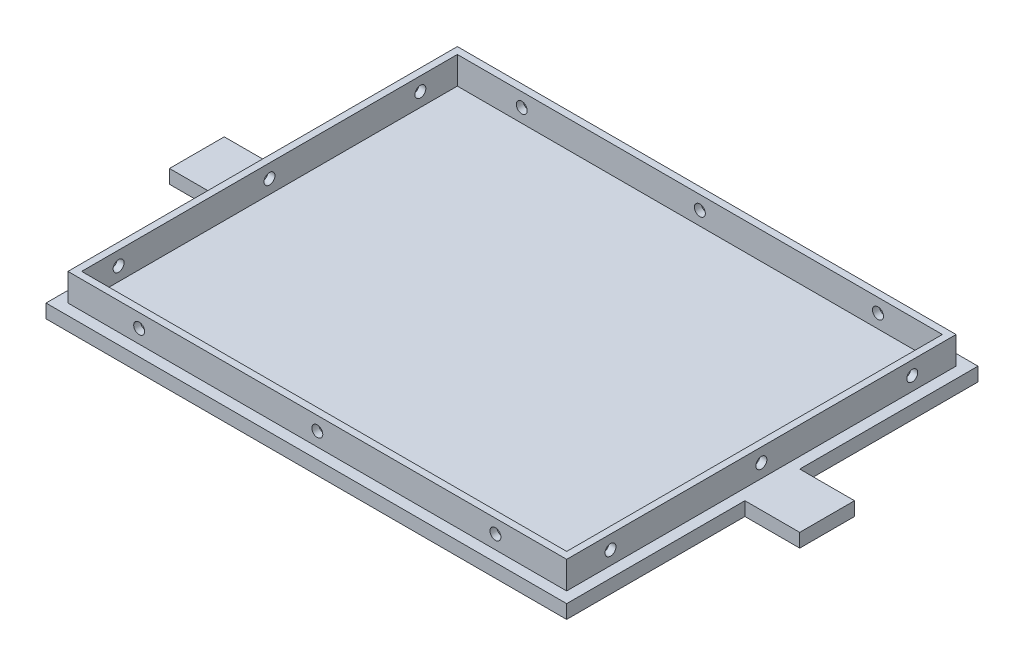
ISO-10303-21;
HEADER;
FILE_DESCRIPTION(('STEP AP214'),'2;1');
FILE_NAME('part.step','',(''),(''),'','','');
FILE_SCHEMA(('AUTOMOTIVE_DESIGN { 1 0 10303 214 1 1 1 1 }'));
ENDSEC;
DATA;
#1=APPLICATION_CONTEXT('core data for automotive mechanical design processes');
#2=APPLICATION_PROTOCOL_DEFINITION('international standard','automotive_design',2000,#1);
#3=PRODUCT_CONTEXT('',#1,'mechanical');
#4=PRODUCT('Part','Part','',(#3));
#5=PRODUCT_RELATED_PRODUCT_CATEGORY('part','',(#4));
#6=PRODUCT_DEFINITION_FORMATION('','',#4);
#7=PRODUCT_DEFINITION_CONTEXT('part definition',#1,'design');
#8=PRODUCT_DEFINITION('design','',#6,#7);
#9=PRODUCT_DEFINITION_SHAPE('','',#8);
#10=(LENGTH_UNIT() NAMED_UNIT(*) SI_UNIT(.MILLI.,.METRE.));
#11=(NAMED_UNIT(*) PLANE_ANGLE_UNIT() SI_UNIT($,.RADIAN.));
#12=(NAMED_UNIT(*) SI_UNIT($,.STERADIAN.) SOLID_ANGLE_UNIT());
#13=UNCERTAINTY_MEASURE_WITH_UNIT(LENGTH_MEASURE(1.E-05),#10,'distance_accuracy_value','');
#14=(GEOMETRIC_REPRESENTATION_CONTEXT(3) GLOBAL_UNCERTAINTY_ASSIGNED_CONTEXT((#13)) GLOBAL_UNIT_ASSIGNED_CONTEXT((#10,
#11,#12)) REPRESENTATION_CONTEXT('',''));
#15=CARTESIAN_POINT('',(0.,0.,0.));
#16=DIRECTION('',(0.,0.,1.));
#17=DIRECTION('',(1.,0.,0.));
#18=AXIS2_PLACEMENT_3D('',#15,#16,#17);
#19=CARTESIAN_POINT('',(0.,5.,0.));
#20=DIRECTION('',(0.,1.,0.));
#21=DIRECTION('',(0.,0.,1.));
#22=AXIS2_PLACEMENT_3D('',#19,#20,#21);
#23=PLANE('',#22);
#24=DIRECTION('',(0.,0.,-1.));
#25=VECTOR('',#24,1.);
#26=CARTESIAN_POINT('',(95.,5.,10.));
#27=LINE('',#26,#25);
#28=CARTESIAN_POINT('',(95.,5.,75.055));
#29=VERTEX_POINT('',#28);
#30=CARTESIAN_POINT('',(95.,5.,10.));
#31=VERTEX_POINT('',#30);
#32=EDGE_CURVE('E242',#29,#31,#27,.T.);
#33=ORIENTED_EDGE('',*,*,#32,.T.);
#34=DIRECTION('',(1.,0.,0.));
#35=VECTOR('',#34,1.);
#36=CARTESIAN_POINT('',(115.,5.,10.));
#37=LINE('',#36,#35);
#38=CARTESIAN_POINT('',(115.,5.,10.));
#39=VERTEX_POINT('',#38);
#40=EDGE_CURVE('E245',#31,#39,#37,.T.);
#41=ORIENTED_EDGE('',*,*,#40,.T.);
#42=DIRECTION('',(0.,0.,-1.));
#43=VECTOR('',#42,1.);
#44=CARTESIAN_POINT('',(115.,5.,-10.));
#45=LINE('',#44,#43);
#46=CARTESIAN_POINT('',(115.,5.,-10.));
#47=VERTEX_POINT('',#46);
#48=EDGE_CURVE('E248',#39,#47,#45,.T.);
#49=ORIENTED_EDGE('',*,*,#48,.T.);
#50=DIRECTION('',(-1.,0.,0.));
#51=VECTOR('',#50,1.);
#52=CARTESIAN_POINT('',(95.,5.,-10.));
#53=LINE('',#52,#51);
#54=CARTESIAN_POINT('',(95.,5.,-10.));
#55=VERTEX_POINT('',#54);
#56=EDGE_CURVE('E250',#47,#55,#53,.T.);
#57=ORIENTED_EDGE('',*,*,#56,.T.);
#58=DIRECTION('',(0.,0.,-1.));
#59=VECTOR('',#58,1.);
#60=CARTESIAN_POINT('',(95.,5.,-75.055));
#61=LINE('',#60,#59);
#62=CARTESIAN_POINT('',(95.,5.,-75.055));
#63=VERTEX_POINT('',#62);
#64=EDGE_CURVE('E252',#55,#63,#61,.T.);
#65=ORIENTED_EDGE('',*,*,#64,.T.);
#66=DIRECTION('',(-1.,0.,0.));
#67=VECTOR('',#66,1.);
#68=CARTESIAN_POINT('',(-95.,5.,-75.055));
#69=LINE('',#68,#67);
#70=CARTESIAN_POINT('',(-95.,5.,-75.055));
#71=VERTEX_POINT('',#70);
#72=EDGE_CURVE('E254',#63,#71,#69,.T.);
#73=ORIENTED_EDGE('',*,*,#72,.T.);
#74=DIRECTION('',(0.,0.,1.));
#75=VECTOR('',#74,1.);
#76=CARTESIAN_POINT('',(-95.,5.,-75.055));
#77=LINE('',#76,#75);
#78=CARTESIAN_POINT('',(-94.9999999999999,5.,-10.));
#79=VERTEX_POINT('',#78);
#80=EDGE_CURVE('E256',#71,#79,#77,.T.);
#81=ORIENTED_EDGE('',*,*,#80,.T.);
#82=DIRECTION('',(-1.,0.,0.));
#83=VECTOR('',#82,1.);
#84=CARTESIAN_POINT('',(-94.9999999999999,5.,-10.));
#85=LINE('',#84,#83);
#86=CARTESIAN_POINT('',(-115.,5.,-10.));
#87=VERTEX_POINT('',#86);
#88=EDGE_CURVE('E258',#79,#87,#85,.T.);
#89=ORIENTED_EDGE('',*,*,#88,.T.);
#90=DIRECTION('',(0.,0.,1.));
#91=VECTOR('',#90,1.);
#92=CARTESIAN_POINT('',(-115.,5.,-10.));
#93=LINE('',#92,#91);
#94=CARTESIAN_POINT('',(-115.,5.,10.));
#95=VERTEX_POINT('',#94);
#96=EDGE_CURVE('E260',#87,#95,#93,.T.);
#97=ORIENTED_EDGE('',*,*,#96,.T.);
#98=DIRECTION('',(1.,0.,0.));
#99=VECTOR('',#98,1.);
#100=CARTESIAN_POINT('',(-115.,5.,10.));
#101=LINE('',#100,#99);
#102=CARTESIAN_POINT('',(-94.9999999999999,5.,10.));
#103=VERTEX_POINT('',#102);
#104=EDGE_CURVE('E262',#95,#103,#101,.T.);
#105=ORIENTED_EDGE('',*,*,#104,.T.);
#106=DIRECTION('',(0.,0.,1.));
#107=VECTOR('',#106,1.);
#108=CARTESIAN_POINT('',(-94.9999999999999,5.,10.));
#109=LINE('',#108,#107);
#110=CARTESIAN_POINT('',(-95.,5.,75.055));
#111=VERTEX_POINT('',#110);
#112=EDGE_CURVE('E264',#103,#111,#109,.T.);
#113=ORIENTED_EDGE('',*,*,#112,.T.);
#114=DIRECTION('',(1.,0.,0.));
#115=VECTOR('',#114,1.);
#116=CARTESIAN_POINT('',(-95.,5.,75.055));
#117=LINE('',#116,#115);
#118=EDGE_CURVE('E266',#111,#29,#117,.T.);
#119=ORIENTED_EDGE('',*,*,#118,.T.);
#120=EDGE_LOOP('',(#33,#41,#49,#57,#65,#73,#81,#89,#97,#105,#113,#119));
#121=FACE_BOUND('',#120,.T.);
#122=DIRECTION('',(-1.,0.,0.));
#123=VECTOR('',#122,1.);
#124=CARTESIAN_POINT('',(91.,5.,-71.055));
#125=LINE('',#124,#123);
#126=CARTESIAN_POINT('',(91.,5.,-71.055));
#127=VERTEX_POINT('',#126);
#128=CARTESIAN_POINT('',(-91.,5.,-71.055));
#129=VERTEX_POINT('',#128);
#130=EDGE_CURVE('E228',#127,#129,#125,.T.);
#131=ORIENTED_EDGE('',*,*,#130,.F.);
#132=DIRECTION('',(0.,0.,-1.));
#133=VECTOR('',#132,1.);
#134=CARTESIAN_POINT('',(91.,5.,71.055));
#135=LINE('',#134,#133);
#136=CARTESIAN_POINT('',(91.,5.,71.055));
#137=VERTEX_POINT('',#136);
#138=EDGE_CURVE('E191',#137,#127,#135,.T.);
#139=ORIENTED_EDGE('',*,*,#138,.F.);
#140=DIRECTION('',(1.,0.,0.));
#141=VECTOR('',#140,1.);
#142=CARTESIAN_POINT('',(91.,5.,71.055));
#143=LINE('',#142,#141);
#144=CARTESIAN_POINT('',(-91.,5.,71.055));
#145=VERTEX_POINT('',#144);
#146=EDGE_CURVE('E219',#145,#137,#143,.T.);
#147=ORIENTED_EDGE('',*,*,#146,.F.);
#148=DIRECTION('',(0.,0.,1.));
#149=VECTOR('',#148,1.);
#150=CARTESIAN_POINT('',(-91.,5.,71.055));
#151=LINE('',#150,#149);
#152=EDGE_CURVE('E230',#129,#145,#151,.T.);
#153=ORIENTED_EDGE('',*,*,#152,.F.);
#154=EDGE_LOOP('',(#131,#139,#147,#153));
#155=FACE_BOUND('',#154,.T.);
#156=ADVANCED_FACE('F33',(#121,#155),#23,.T.);
#157=CARTESIAN_POINT('',(95.,5.,10.));
#158=DIRECTION('',(-1.,0.,0.));
#159=DIRECTION('',(0.,0.,1.));
#160=AXIS2_PLACEMENT_3D('',#157,#158,#159);
#161=PLANE('',#160);
#162=DIRECTION('',(0.,0.,-1.));
#163=VECTOR('',#162,1.);
#164=CARTESIAN_POINT('',(95.,0.,10.));
#165=LINE('',#164,#163);
#166=CARTESIAN_POINT('',(95.,0.,75.055));
#167=VERTEX_POINT('',#166);
#168=CARTESIAN_POINT('',(95.,0.,10.));
#169=VERTEX_POINT('',#168);
#170=EDGE_CURVE('E241',#167,#169,#165,.T.);
#171=ORIENTED_EDGE('',*,*,#170,.T.);
#172=DIRECTION('',(0.,-1.,0.));
#173=VECTOR('',#172,1.);
#174=CARTESIAN_POINT('',(95.,5.,10.));
#175=LINE('',#174,#173);
#176=EDGE_CURVE('E11',#31,#169,#175,.T.);
#177=ORIENTED_EDGE('',*,*,#176,.F.);
#178=ORIENTED_EDGE('',*,*,#32,.F.);
#179=DIRECTION('',(0.,-1.,0.));
#180=VECTOR('',#179,1.);
#181=CARTESIAN_POINT('',(95.,5.,75.055));
#182=LINE('',#181,#180);
#183=EDGE_CURVE('E268',#29,#167,#182,.T.);
#184=ORIENTED_EDGE('',*,*,#183,.T.);
#185=EDGE_LOOP('',(#171,#177,#178,#184));
#186=FACE_BOUND('',#185,.T.);
#187=ADVANCED_FACE('F35',(#186),#161,.F.);
#188=CARTESIAN_POINT('',(115.,5.,10.));
#189=DIRECTION('',(0.,0.,-1.));
#190=DIRECTION('',(-1.,0.,0.));
#191=AXIS2_PLACEMENT_3D('',#188,#189,#190);
#192=PLANE('',#191);
#193=DIRECTION('',(1.,0.,0.));
#194=VECTOR('',#193,1.);
#195=CARTESIAN_POINT('',(115.,0.,10.));
#196=LINE('',#195,#194);
#197=CARTESIAN_POINT('',(115.,0.,10.));
#198=VERTEX_POINT('',#197);
#199=EDGE_CURVE('E271',#169,#198,#196,.T.);
#200=ORIENTED_EDGE('',*,*,#199,.T.);
#201=DIRECTION('',(0.,-1.,0.));
#202=VECTOR('',#201,1.);
#203=CARTESIAN_POINT('',(115.,5.,10.));
#204=LINE('',#203,#202);
#205=EDGE_CURVE('E42',#39,#198,#204,.T.);
#206=ORIENTED_EDGE('',*,*,#205,.F.);
#207=ORIENTED_EDGE('',*,*,#40,.F.);
#208=ORIENTED_EDGE('',*,*,#176,.T.);
#209=EDGE_LOOP('',(#200,#206,#207,#208));
#210=FACE_BOUND('',#209,.T.);
#211=ADVANCED_FACE('F424',(#210),#192,.F.);
#212=CARTESIAN_POINT('',(115.,5.,-10.));
#213=DIRECTION('',(-1.,0.,0.));
#214=DIRECTION('',(0.,0.,1.));
#215=AXIS2_PLACEMENT_3D('',#212,#213,#214);
#216=PLANE('',#215);
#217=DIRECTION('',(0.,0.,-1.));
#218=VECTOR('',#217,1.);
#219=CARTESIAN_POINT('',(115.,0.,-10.));
#220=LINE('',#219,#218);
#221=CARTESIAN_POINT('',(115.,0.,-10.));
#222=VERTEX_POINT('',#221);
#223=EDGE_CURVE('E273',#198,#222,#220,.T.);
#224=ORIENTED_EDGE('',*,*,#223,.T.);
#225=DIRECTION('',(0.,-1.,0.));
#226=VECTOR('',#225,1.);
#227=CARTESIAN_POINT('',(115.,5.,-10.));
#228=LINE('',#227,#226);
#229=EDGE_CURVE('E318',#47,#222,#228,.T.);
#230=ORIENTED_EDGE('',*,*,#229,.F.);
#231=ORIENTED_EDGE('',*,*,#48,.F.);
#232=ORIENTED_EDGE('',*,*,#205,.T.);
#233=EDGE_LOOP('',(#224,#230,#231,#232));
#234=FACE_BOUND('',#233,.T.);
#235=ADVANCED_FACE('F725',(#234),#216,.F.);
#236=CARTESIAN_POINT('',(95.,5.,-10.));
#237=DIRECTION('',(0.,0.,1.));
#238=DIRECTION('',(1.,0.,0.));
#239=AXIS2_PLACEMENT_3D('',#236,#237,#238);
#240=PLANE('',#239);
#241=DIRECTION('',(-1.,0.,0.));
#242=VECTOR('',#241,1.);
#243=CARTESIAN_POINT('',(95.,0.,-10.));
#244=LINE('',#243,#242);
#245=CARTESIAN_POINT('',(95.,0.,-10.));
#246=VERTEX_POINT('',#245);
#247=EDGE_CURVE('E275',#222,#246,#244,.T.);
#248=ORIENTED_EDGE('',*,*,#247,.T.);
#249=DIRECTION('',(0.,-1.,0.));
#250=VECTOR('',#249,1.);
#251=CARTESIAN_POINT('',(95.,5.,-10.));
#252=LINE('',#251,#250);
#253=EDGE_CURVE('E315',#55,#246,#252,.T.);
#254=ORIENTED_EDGE('',*,*,#253,.F.);
#255=ORIENTED_EDGE('',*,*,#56,.F.);
#256=ORIENTED_EDGE('',*,*,#229,.T.);
#257=EDGE_LOOP('',(#248,#254,#255,#256));
#258=FACE_BOUND('',#257,.T.);
#259=ADVANCED_FACE('F716',(#258),#240,.F.);
#260=CARTESIAN_POINT('',(95.,5.,-75.055));
#261=DIRECTION('',(-1.,0.,0.));
#262=DIRECTION('',(0.,0.,1.));
#263=AXIS2_PLACEMENT_3D('',#260,#261,#262);
#264=PLANE('',#263);
#265=DIRECTION('',(0.,0.,-1.));
#266=VECTOR('',#265,1.);
#267=CARTESIAN_POINT('',(95.,0.,-75.055));
#268=LINE('',#267,#266);
#269=CARTESIAN_POINT('',(95.,0.,-75.055));
#270=VERTEX_POINT('',#269);
#271=EDGE_CURVE('E277',#246,#270,#268,.T.);
#272=ORIENTED_EDGE('',*,*,#271,.T.);
#273=DIRECTION('',(0.,-1.,0.));
#274=VECTOR('',#273,1.);
#275=CARTESIAN_POINT('',(95.,5.,-75.055));
#276=LINE('',#275,#274);
#277=EDGE_CURVE('E312',#63,#270,#276,.T.);
#278=ORIENTED_EDGE('',*,*,#277,.F.);
#279=ORIENTED_EDGE('',*,*,#64,.F.);
#280=ORIENTED_EDGE('',*,*,#253,.T.);
#281=EDGE_LOOP('',(#272,#278,#279,#280));
#282=FACE_BOUND('',#281,.T.);
#283=ADVANCED_FACE('F707',(#282),#264,.F.);
#284=CARTESIAN_POINT('',(-95.,5.,-75.055));
#285=DIRECTION('',(0.,0.,1.));
#286=DIRECTION('',(1.,0.,0.));
#287=AXIS2_PLACEMENT_3D('',#284,#285,#286);
#288=PLANE('',#287);
#289=DIRECTION('',(-1.,0.,0.));
#290=VECTOR('',#289,1.);
#291=CARTESIAN_POINT('',(-95.,0.,-75.055));
#292=LINE('',#291,#290);
#293=CARTESIAN_POINT('',(-95.,0.,-75.055));
#294=VERTEX_POINT('',#293);
#295=EDGE_CURVE('E279',#270,#294,#292,.T.);
#296=ORIENTED_EDGE('',*,*,#295,.T.);
#297=DIRECTION('',(0.,-1.,0.));
#298=VECTOR('',#297,1.);
#299=CARTESIAN_POINT('',(-95.,5.,-75.055));
#300=LINE('',#299,#298);
#301=EDGE_CURVE('E309',#71,#294,#300,.T.);
#302=ORIENTED_EDGE('',*,*,#301,.F.);
#303=ORIENTED_EDGE('',*,*,#72,.F.);
#304=ORIENTED_EDGE('',*,*,#277,.T.);
#305=EDGE_LOOP('',(#296,#302,#303,#304));
#306=FACE_BOUND('',#305,.T.);
#307=ADVANCED_FACE('F698',(#306),#288,.F.);
#308=CARTESIAN_POINT('',(-95.,5.,-75.055));
#309=DIRECTION('',(1.,0.,0.));
#310=DIRECTION('',(0.,0.,-1.));
#311=AXIS2_PLACEMENT_3D('',#308,#309,#310);
#312=PLANE('',#311);
#313=DIRECTION('',(0.,0.,1.));
#314=VECTOR('',#313,1.);
#315=CARTESIAN_POINT('',(-95.,0.,-75.055));
#316=LINE('',#315,#314);
#317=CARTESIAN_POINT('',(-94.9999999999999,0.,-10.));
#318=VERTEX_POINT('',#317);
#319=EDGE_CURVE('E281',#294,#318,#316,.T.);
#320=ORIENTED_EDGE('',*,*,#319,.T.);
#321=DIRECTION('',(0.,-1.,0.));
#322=VECTOR('',#321,1.);
#323=CARTESIAN_POINT('',(-94.9999999999999,5.,-10.));
#324=LINE('',#323,#322);
#325=EDGE_CURVE('E306',#79,#318,#324,.T.);
#326=ORIENTED_EDGE('',*,*,#325,.F.);
#327=ORIENTED_EDGE('',*,*,#80,.F.);
#328=ORIENTED_EDGE('',*,*,#301,.T.);
#329=EDGE_LOOP('',(#320,#326,#327,#328));
#330=FACE_BOUND('',#329,.T.);
#331=ADVANCED_FACE('F689',(#330),#312,.F.);
#332=CARTESIAN_POINT('',(-94.9999999999999,5.,-10.));
#333=DIRECTION('',(0.,0.,1.));
#334=DIRECTION('',(1.,0.,0.));
#335=AXIS2_PLACEMENT_3D('',#332,#333,#334);
#336=PLANE('',#335);
#337=DIRECTION('',(-1.,0.,0.));
#338=VECTOR('',#337,1.);
#339=CARTESIAN_POINT('',(-94.9999999999999,0.,-10.));
#340=LINE('',#339,#338);
#341=CARTESIAN_POINT('',(-115.,0.,-10.));
#342=VERTEX_POINT('',#341);
#343=EDGE_CURVE('E283',#318,#342,#340,.T.);
#344=ORIENTED_EDGE('',*,*,#343,.T.);
#345=DIRECTION('',(0.,-1.,0.));
#346=VECTOR('',#345,1.);
#347=CARTESIAN_POINT('',(-115.,5.,-10.));
#348=LINE('',#347,#346);
#349=EDGE_CURVE('E303',#87,#342,#348,.T.);
#350=ORIENTED_EDGE('',*,*,#349,.F.);
#351=ORIENTED_EDGE('',*,*,#88,.F.);
#352=ORIENTED_EDGE('',*,*,#325,.T.);
#353=EDGE_LOOP('',(#344,#350,#351,#352));
#354=FACE_BOUND('',#353,.T.);
#355=ADVANCED_FACE('F680',(#354),#336,.F.);
#356=CARTESIAN_POINT('',(-115.,5.,-10.));
#357=DIRECTION('',(1.,0.,0.));
#358=DIRECTION('',(0.,0.,-1.));
#359=AXIS2_PLACEMENT_3D('',#356,#357,#358);
#360=PLANE('',#359);
#361=DIRECTION('',(0.,0.,1.));
#362=VECTOR('',#361,1.);
#363=CARTESIAN_POINT('',(-115.,0.,-10.));
#364=LINE('',#363,#362);
#365=CARTESIAN_POINT('',(-115.,0.,10.));
#366=VERTEX_POINT('',#365);
#367=EDGE_CURVE('E285',#342,#366,#364,.T.);
#368=ORIENTED_EDGE('',*,*,#367,.T.);
#369=DIRECTION('',(0.,-1.,0.));
#370=VECTOR('',#369,1.);
#371=CARTESIAN_POINT('',(-115.,5.,10.));
#372=LINE('',#371,#370);
#373=EDGE_CURVE('E300',#95,#366,#372,.T.);
#374=ORIENTED_EDGE('',*,*,#373,.F.);
#375=ORIENTED_EDGE('',*,*,#96,.F.);
#376=ORIENTED_EDGE('',*,*,#349,.T.);
#377=EDGE_LOOP('',(#368,#374,#375,#376));
#378=FACE_BOUND('',#377,.T.);
#379=ADVANCED_FACE('F671',(#378),#360,.F.);
#380=CARTESIAN_POINT('',(-115.,5.,10.));
#381=DIRECTION('',(0.,0.,-1.));
#382=DIRECTION('',(-1.,0.,0.));
#383=AXIS2_PLACEMENT_3D('',#380,#381,#382);
#384=PLANE('',#383);
#385=DIRECTION('',(1.,0.,0.));
#386=VECTOR('',#385,1.);
#387=CARTESIAN_POINT('',(-115.,0.,10.));
#388=LINE('',#387,#386);
#389=CARTESIAN_POINT('',(-94.9999999999999,0.,10.));
#390=VERTEX_POINT('',#389);
#391=EDGE_CURVE('E287',#366,#390,#388,.T.);
#392=ORIENTED_EDGE('',*,*,#391,.T.);
#393=DIRECTION('',(0.,-1.,0.));
#394=VECTOR('',#393,1.);
#395=CARTESIAN_POINT('',(-94.9999999999999,5.,10.));
#396=LINE('',#395,#394);
#397=EDGE_CURVE('E297',#103,#390,#396,.T.);
#398=ORIENTED_EDGE('',*,*,#397,.F.);
#399=ORIENTED_EDGE('',*,*,#104,.F.);
#400=ORIENTED_EDGE('',*,*,#373,.T.);
#401=EDGE_LOOP('',(#392,#398,#399,#400));
#402=FACE_BOUND('',#401,.T.);
#403=ADVANCED_FACE('F662',(#402),#384,.F.);
#404=CARTESIAN_POINT('',(-94.9999999999999,5.,10.));
#405=DIRECTION('',(1.,0.,0.));
#406=DIRECTION('',(0.,0.,-1.));
#407=AXIS2_PLACEMENT_3D('',#404,#405,#406);
#408=PLANE('',#407);
#409=DIRECTION('',(0.,0.,1.));
#410=VECTOR('',#409,1.);
#411=CARTESIAN_POINT('',(-94.9999999999999,0.,10.));
#412=LINE('',#411,#410);
#413=CARTESIAN_POINT('',(-95.,0.,75.055));
#414=VERTEX_POINT('',#413);
#415=EDGE_CURVE('E289',#390,#414,#412,.T.);
#416=ORIENTED_EDGE('',*,*,#415,.T.);
#417=DIRECTION('',(0.,-1.,0.));
#418=VECTOR('',#417,1.);
#419=CARTESIAN_POINT('',(-95.,5.,75.055));
#420=LINE('',#419,#418);
#421=EDGE_CURVE('E294',#111,#414,#420,.T.);
#422=ORIENTED_EDGE('',*,*,#421,.F.);
#423=ORIENTED_EDGE('',*,*,#112,.F.);
#424=ORIENTED_EDGE('',*,*,#397,.T.);
#425=EDGE_LOOP('',(#416,#422,#423,#424));
#426=FACE_BOUND('',#425,.T.);
#427=ADVANCED_FACE('F653',(#426),#408,.F.);
#428=CARTESIAN_POINT('',(-95.,5.,75.055));
#429=DIRECTION('',(0.,0.,-1.));
#430=DIRECTION('',(-1.,0.,0.));
#431=AXIS2_PLACEMENT_3D('',#428,#429,#430);
#432=PLANE('',#431);
#433=DIRECTION('',(1.,0.,0.));
#434=VECTOR('',#433,1.);
#435=CARTESIAN_POINT('',(-95.,0.,75.055));
#436=LINE('',#435,#434);
#437=EDGE_CURVE('E246',#414,#167,#436,.T.);
#438=ORIENTED_EDGE('',*,*,#437,.T.);
#439=ORIENTED_EDGE('',*,*,#183,.F.);
#440=ORIENTED_EDGE('',*,*,#118,.F.);
#441=ORIENTED_EDGE('',*,*,#421,.T.);
#442=EDGE_LOOP('',(#438,#439,#440,#441));
#443=FACE_BOUND('',#442,.T.);
#444=ADVANCED_FACE('F641',(#443),#432,.F.);
#445=CARTESIAN_POINT('',(0.,0.,0.));
#446=DIRECTION('',(0.,1.,0.));
#447=DIRECTION('',(0.,0.,1.));
#448=AXIS2_PLACEMENT_3D('',#445,#446,#447);
#449=PLANE('',#448);
#450=ORIENTED_EDGE('',*,*,#170,.F.);
#451=ORIENTED_EDGE('',*,*,#437,.F.);
#452=ORIENTED_EDGE('',*,*,#415,.F.);
#453=ORIENTED_EDGE('',*,*,#391,.F.);
#454=ORIENTED_EDGE('',*,*,#367,.F.);
#455=ORIENTED_EDGE('',*,*,#343,.F.);
#456=ORIENTED_EDGE('',*,*,#319,.F.);
#457=ORIENTED_EDGE('',*,*,#295,.F.);
#458=ORIENTED_EDGE('',*,*,#271,.F.);
#459=ORIENTED_EDGE('',*,*,#247,.F.);
#460=ORIENTED_EDGE('',*,*,#223,.F.);
#461=ORIENTED_EDGE('',*,*,#199,.F.);
#462=EDGE_LOOP('',(#450,#451,#452,#453,#454,#455,#456,#457,#458,#459,#460,#461));
#463=FACE_BOUND('',#462,.T.);
#464=ADVANCED_FACE('F459',(#463),#449,.F.);
#465=CARTESIAN_POINT('',(0.,15.,0.));
#466=DIRECTION('',(0.,1.,0.));
#467=DIRECTION('',(0.,0.,1.));
#468=AXIS2_PLACEMENT_3D('',#465,#466,#467);
#469=PLANE('',#468);
#470=DIRECTION('',(0.,0.,-1.));
#471=VECTOR('',#470,1.);
#472=CARTESIAN_POINT('',(91.,15.,71.055));
#473=LINE('',#472,#471);
#474=CARTESIAN_POINT('',(91.,15.,71.055));
#475=VERTEX_POINT('',#474);
#476=CARTESIAN_POINT('',(91.,15.,-71.055));
#477=VERTEX_POINT('',#476);
#478=EDGE_CURVE('E215',#475,#477,#473,.T.);
#479=ORIENTED_EDGE('',*,*,#478,.T.);
#480=DIRECTION('',(-1.,0.,0.));
#481=VECTOR('',#480,1.);
#482=CARTESIAN_POINT('',(91.,15.,-71.055));
#483=LINE('',#482,#481);
#484=CARTESIAN_POINT('',(-91.,15.,-71.055));
#485=VERTEX_POINT('',#484);
#486=EDGE_CURVE('E218',#477,#485,#483,.T.);
#487=ORIENTED_EDGE('',*,*,#486,.T.);
#488=DIRECTION('',(0.,0.,1.));
#489=VECTOR('',#488,1.);
#490=CARTESIAN_POINT('',(-91.,15.,71.055));
#491=LINE('',#490,#489);
#492=CARTESIAN_POINT('',(-91.,15.,71.055));
#493=VERTEX_POINT('',#492);
#494=EDGE_CURVE('E221',#485,#493,#491,.T.);
#495=ORIENTED_EDGE('',*,*,#494,.T.);
#496=DIRECTION('',(1.,0.,0.));
#497=VECTOR('',#496,1.);
#498=CARTESIAN_POINT('',(91.,15.,71.055));
#499=LINE('',#498,#497);
#500=EDGE_CURVE('E223',#493,#475,#499,.T.);
#501=ORIENTED_EDGE('',*,*,#500,.T.);
#502=EDGE_LOOP('',(#479,#487,#495,#501));
#503=FACE_BOUND('',#502,.T.);
#504=DIRECTION('',(-1.,0.,0.));
#505=VECTOR('',#504,1.);
#506=CARTESIAN_POINT('',(88.5,15.,-68.555));
#507=LINE('',#506,#505);
#508=CARTESIAN_POINT('',(88.5,15.,-68.555));
#509=VERTEX_POINT('',#508);
#510=CARTESIAN_POINT('',(-88.5,15.,-68.555));
#511=VERTEX_POINT('',#510);
#512=EDGE_CURVE('E183',#509,#511,#507,.T.);
#513=ORIENTED_EDGE('',*,*,#512,.F.);
#514=DIRECTION('',(0.,0.,-1.));
#515=VECTOR('',#514,1.);
#516=CARTESIAN_POINT('',(88.5,15.,68.555));
#517=LINE('',#516,#515);
#518=CARTESIAN_POINT('',(88.5,15.,68.555));
#519=VERTEX_POINT('',#518);
#520=EDGE_CURVE('E174',#519,#509,#517,.T.);
#521=ORIENTED_EDGE('',*,*,#520,.F.);
#522=DIRECTION('',(1.,0.,0.));
#523=VECTOR('',#522,1.);
#524=CARTESIAN_POINT('',(88.5,15.,68.555));
#525=LINE('',#524,#523);
#526=CARTESIAN_POINT('',(-88.5,15.,68.555));
#527=VERTEX_POINT('',#526);
#528=EDGE_CURVE('E199',#527,#519,#525,.T.);
#529=ORIENTED_EDGE('',*,*,#528,.F.);
#530=DIRECTION('',(0.,0.,1.));
#531=VECTOR('',#530,1.);
#532=CARTESIAN_POINT('',(-88.5,15.,68.555));
#533=LINE('',#532,#531);
#534=EDGE_CURVE('E197',#511,#527,#533,.T.);
#535=ORIENTED_EDGE('',*,*,#534,.F.);
#536=EDGE_LOOP('',(#513,#521,#529,#535));
#537=FACE_BOUND('',#536,.T.);
#538=ADVANCED_FACE('F195',(#503,#537),#469,.T.);
#539=CARTESIAN_POINT('',(91.,15.,71.055));
#540=DIRECTION('',(-1.,0.,0.));
#541=DIRECTION('',(0.,0.,1.));
#542=AXIS2_PLACEMENT_3D('',#539,#540,#541);
#543=PLANE('',#542);
#544=CARTESIAN_POINT('',(91.,10.,55.0550000000001));
#545=DIRECTION('',(-1.,0.,0.));
#546=DIRECTION('',(0.,0.,1.));
#547=AXIS2_PLACEMENT_3D('',#544,#545,#546);
#548=CIRCLE('',#547,2.);
#549=CARTESIAN_POINT('',(91.,10.,57.0550000000001));
#550=VERTEX_POINT('',#549);
#551=EDGE_CURVE('E327',#550,#550,#548,.T.);
#552=ORIENTED_EDGE('',*,*,#551,.T.);
#553=EDGE_LOOP('',(#552));
#554=FACE_BOUND('',#553,.T.);
#555=CARTESIAN_POINT('',(91.,10.,0.));
#556=DIRECTION('',(-1.,0.,0.));
#557=DIRECTION('',(0.,0.,1.));
#558=AXIS2_PLACEMENT_3D('',#555,#556,#557);
#559=CIRCLE('',#558,2.);
#560=CARTESIAN_POINT('',(91.,10.,2.00000000000007));
#561=VERTEX_POINT('',#560);
#562=EDGE_CURVE('E361',#561,#561,#559,.T.);
#563=ORIENTED_EDGE('',*,*,#562,.T.);
#564=EDGE_LOOP('',(#563));
#565=FACE_BOUND('',#564,.T.);
#566=CARTESIAN_POINT('',(91.,10.,-55.0549999999999));
#567=DIRECTION('',(-1.,0.,0.));
#568=DIRECTION('',(0.,0.,1.));
#569=AXIS2_PLACEMENT_3D('',#566,#567,#568);
#570=CIRCLE('',#569,2.);
#571=CARTESIAN_POINT('',(91.,10.,-53.0549999999999));
#572=VERTEX_POINT('',#571);
#573=EDGE_CURVE('E344',#572,#572,#570,.T.);
#574=ORIENTED_EDGE('',*,*,#573,.T.);
#575=EDGE_LOOP('',(#574));
#576=FACE_BOUND('',#575,.T.);
#577=ORIENTED_EDGE('',*,*,#138,.T.);
#578=DIRECTION('',(0.,-1.,0.));
#579=VECTOR('',#578,1.);
#580=CARTESIAN_POINT('',(91.,15.,-71.055));
#581=LINE('',#580,#579);
#582=EDGE_CURVE('E239',#477,#127,#581,.T.);
#583=ORIENTED_EDGE('',*,*,#582,.F.);
#584=ORIENTED_EDGE('',*,*,#478,.F.);
#585=DIRECTION('',(0.,-1.,0.));
#586=VECTOR('',#585,1.);
#587=CARTESIAN_POINT('',(91.,15.,71.055));
#588=LINE('',#587,#586);
#589=EDGE_CURVE('E225',#475,#137,#588,.T.);
#590=ORIENTED_EDGE('',*,*,#589,.T.);
#591=EDGE_LOOP('',(#577,#583,#584,#590));
#592=FACE_BOUND('',#591,.T.);
#593=ADVANCED_FACE('F458',(#554,#565,#576,#592),#543,.F.);
#594=CARTESIAN_POINT('',(91.,15.,-71.055));
#595=DIRECTION('',(0.,0.,1.));
#596=DIRECTION('',(1.,0.,0.));
#597=AXIS2_PLACEMENT_3D('',#594,#595,#596);
#598=PLANE('',#597);
#599=CARTESIAN_POINT('',(-65.,10.,-71.055));
#600=DIRECTION('',(0.,0.,1.));
#601=DIRECTION('',(1.,0.,0.));
#602=AXIS2_PLACEMENT_3D('',#599,#600,#601);
#603=CIRCLE('',#602,2.);
#604=CARTESIAN_POINT('',(-63.,10.,-71.055));
#605=VERTEX_POINT('',#604);
#606=EDGE_CURVE('E205',#605,#605,#603,.T.);
#607=ORIENTED_EDGE('',*,*,#606,.T.);
#608=EDGE_LOOP('',(#607));
#609=FACE_BOUND('',#608,.T.);
#610=CARTESIAN_POINT('',(0.,10.,-71.055));
#611=DIRECTION('',(0.,0.,1.));
#612=DIRECTION('',(1.,0.,0.));
#613=AXIS2_PLACEMENT_3D('',#610,#611,#612);
#614=CIRCLE('',#613,2.);
#615=CARTESIAN_POINT('',(2.00000000000003,10.,-71.055));
#616=VERTEX_POINT('',#615);
#617=EDGE_CURVE('E337',#616,#616,#614,.T.);
#618=ORIENTED_EDGE('',*,*,#617,.T.);
#619=EDGE_LOOP('',(#618));
#620=FACE_BOUND('',#619,.T.);
#621=CARTESIAN_POINT('',(65.,10.,-71.055));
#622=DIRECTION('',(0.,0.,1.));
#623=DIRECTION('',(1.,0.,0.));
#624=AXIS2_PLACEMENT_3D('',#621,#622,#623);
#625=CIRCLE('',#624,2.);
#626=CARTESIAN_POINT('',(67.,10.,-71.055));
#627=VERTEX_POINT('',#626);
#628=EDGE_CURVE('E332',#627,#627,#625,.T.);
#629=ORIENTED_EDGE('',*,*,#628,.T.);
#630=EDGE_LOOP('',(#629));
#631=FACE_BOUND('',#630,.T.);
#632=ORIENTED_EDGE('',*,*,#130,.T.);
#633=DIRECTION('',(0.,-1.,0.));
#634=VECTOR('',#633,1.);
#635=CARTESIAN_POINT('',(-91.,15.,-71.055));
#636=LINE('',#635,#634);
#637=EDGE_CURVE('E236',#485,#129,#636,.T.);
#638=ORIENTED_EDGE('',*,*,#637,.F.);
#639=ORIENTED_EDGE('',*,*,#486,.F.);
#640=ORIENTED_EDGE('',*,*,#582,.T.);
#641=EDGE_LOOP('',(#632,#638,#639,#640));
#642=FACE_BOUND('',#641,.T.);
#643=ADVANCED_FACE('F393',(#609,#620,#631,#642),#598,.F.);
#644=CARTESIAN_POINT('',(-91.,15.,71.055));
#645=DIRECTION('',(1.,0.,0.));
#646=DIRECTION('',(0.,0.,-1.));
#647=AXIS2_PLACEMENT_3D('',#644,#645,#646);
#648=PLANE('',#647);
#649=CARTESIAN_POINT('',(-91.,10.,55.055));
#650=DIRECTION('',(1.,0.,0.));
#651=DIRECTION('',(0.,0.,-1.));
#652=AXIS2_PLACEMENT_3D('',#649,#650,#651);
#653=CIRCLE('',#652,2.);
#654=CARTESIAN_POINT('',(-91.,10.,53.055));
#655=VERTEX_POINT('',#654);
#656=EDGE_CURVE('E367',#655,#655,#653,.T.);
#657=ORIENTED_EDGE('',*,*,#656,.T.);
#658=EDGE_LOOP('',(#657));
#659=FACE_BOUND('',#658,.T.);
#660=CARTESIAN_POINT('',(-91.,10.,0.));
#661=DIRECTION('',(1.,0.,0.));
#662=DIRECTION('',(0.,0.,-1.));
#663=AXIS2_PLACEMENT_3D('',#660,#661,#662);
#664=CIRCLE('',#663,2.);
#665=CARTESIAN_POINT('',(-91.,10.,-2.00000000000001));
#666=VERTEX_POINT('',#665);
#667=EDGE_CURVE('E348',#666,#666,#664,.T.);
#668=ORIENTED_EDGE('',*,*,#667,.T.);
#669=EDGE_LOOP('',(#668));
#670=FACE_BOUND('',#669,.T.);
#671=CARTESIAN_POINT('',(-91.,10.,-55.055));
#672=DIRECTION('',(1.,0.,0.));
#673=DIRECTION('',(0.,0.,-1.));
#674=AXIS2_PLACEMENT_3D('',#671,#672,#673);
#675=CIRCLE('',#674,2.);
#676=CARTESIAN_POINT('',(-91.,10.,-57.055));
#677=VERTEX_POINT('',#676);
#678=EDGE_CURVE('E351',#677,#677,#675,.T.);
#679=ORIENTED_EDGE('',*,*,#678,.T.);
#680=EDGE_LOOP('',(#679));
#681=FACE_BOUND('',#680,.T.);
#682=ORIENTED_EDGE('',*,*,#152,.T.);
#683=DIRECTION('',(0.,-1.,0.));
#684=VECTOR('',#683,1.);
#685=CARTESIAN_POINT('',(-91.,15.,71.055));
#686=LINE('',#685,#684);
#687=EDGE_CURVE('E50',#493,#145,#686,.T.);
#688=ORIENTED_EDGE('',*,*,#687,.F.);
#689=ORIENTED_EDGE('',*,*,#494,.F.);
#690=ORIENTED_EDGE('',*,*,#637,.T.);
#691=EDGE_LOOP('',(#682,#688,#689,#690));
#692=FACE_BOUND('',#691,.T.);
#693=ADVANCED_FACE('F463',(#659,#670,#681,#692),#648,.F.);
#694=CARTESIAN_POINT('',(91.,15.,71.055));
#695=DIRECTION('',(0.,0.,-1.));
#696=DIRECTION('',(-1.,0.,0.));
#697=AXIS2_PLACEMENT_3D('',#694,#695,#696);
#698=PLANE('',#697);
#699=CARTESIAN_POINT('',(-65.,10.,71.055));
#700=DIRECTION('',(0.,0.,-1.));
#701=DIRECTION('',(-1.,0.,0.));
#702=AXIS2_PLACEMENT_3D('',#699,#700,#701);
#703=CIRCLE('',#702,2.);
#704=CARTESIAN_POINT('',(-67.,10.,71.055));
#705=VERTEX_POINT('',#704);
#706=EDGE_CURVE('E388',#705,#705,#703,.T.);
#707=ORIENTED_EDGE('',*,*,#706,.T.);
#708=EDGE_LOOP('',(#707));
#709=FACE_BOUND('',#708,.T.);
#710=CARTESIAN_POINT('',(0.,10.,71.055));
#711=DIRECTION('',(0.,0.,-1.));
#712=DIRECTION('',(-1.,0.,0.));
#713=AXIS2_PLACEMENT_3D('',#710,#711,#712);
#714=CIRCLE('',#713,2.);
#715=CARTESIAN_POINT('',(-1.99999999999997,10.,71.055));
#716=VERTEX_POINT('',#715);
#717=EDGE_CURVE('E381',#716,#716,#714,.T.);
#718=ORIENTED_EDGE('',*,*,#717,.T.);
#719=EDGE_LOOP('',(#718));
#720=FACE_BOUND('',#719,.T.);
#721=CARTESIAN_POINT('',(65.,10.,71.055));
#722=DIRECTION('',(0.,0.,-1.));
#723=DIRECTION('',(-1.,0.,0.));
#724=AXIS2_PLACEMENT_3D('',#721,#722,#723);
#725=CIRCLE('',#724,2.);
#726=CARTESIAN_POINT('',(63.,10.,71.055));
#727=VERTEX_POINT('',#726);
#728=EDGE_CURVE('E374',#727,#727,#725,.T.);
#729=ORIENTED_EDGE('',*,*,#728,.T.);
#730=EDGE_LOOP('',(#729));
#731=FACE_BOUND('',#730,.T.);
#732=ORIENTED_EDGE('',*,*,#146,.T.);
#733=ORIENTED_EDGE('',*,*,#589,.F.);
#734=ORIENTED_EDGE('',*,*,#500,.F.);
#735=ORIENTED_EDGE('',*,*,#687,.T.);
#736=EDGE_LOOP('',(#732,#733,#734,#735));
#737=FACE_BOUND('',#736,.T.);
#738=ADVANCED_FACE('F454',(#709,#720,#731,#737),#698,.F.);
#739=CARTESIAN_POINT('',(88.5,15.,68.555));
#740=DIRECTION('',(-1.,0.,0.));
#741=DIRECTION('',(0.,0.,1.));
#742=AXIS2_PLACEMENT_3D('',#739,#740,#741);
#743=PLANE('',#742);
#744=CARTESIAN_POINT('',(88.5,10.,55.0550000000001));
#745=DIRECTION('',(-1.,0.,0.));
#746=DIRECTION('',(0.,0.,1.));
#747=AXIS2_PLACEMENT_3D('',#744,#745,#746);
#748=CIRCLE('',#747,2.);
#749=CARTESIAN_POINT('',(88.5,10.,57.0550000000001));
#750=VERTEX_POINT('',#749);
#751=EDGE_CURVE('E364',#750,#750,#748,.T.);
#752=ORIENTED_EDGE('',*,*,#751,.F.);
#753=EDGE_LOOP('',(#752));
#754=FACE_BOUND('',#753,.T.);
#755=CARTESIAN_POINT('',(88.5,10.,0.));
#756=DIRECTION('',(-1.,0.,0.));
#757=DIRECTION('',(0.,0.,1.));
#758=AXIS2_PLACEMENT_3D('',#755,#756,#757);
#759=CIRCLE('',#758,2.);
#760=CARTESIAN_POINT('',(88.5,10.,2.00000000000007));
#761=VERTEX_POINT('',#760);
#762=EDGE_CURVE('E343',#761,#761,#759,.T.);
#763=ORIENTED_EDGE('',*,*,#762,.F.);
#764=EDGE_LOOP('',(#763));
#765=FACE_BOUND('',#764,.T.);
#766=CARTESIAN_POINT('',(88.5,10.,-55.0549999999999));
#767=DIRECTION('',(-1.,0.,0.));
#768=DIRECTION('',(0.,0.,1.));
#769=AXIS2_PLACEMENT_3D('',#766,#767,#768);
#770=CIRCLE('',#769,2.);
#771=CARTESIAN_POINT('',(88.5,10.,-53.0549999999999));
#772=VERTEX_POINT('',#771);
#773=EDGE_CURVE('E340',#772,#772,#770,.T.);
#774=ORIENTED_EDGE('',*,*,#773,.F.);
#775=EDGE_LOOP('',(#774));
#776=FACE_BOUND('',#775,.T.);
#777=DIRECTION('',(0.,0.,-1.));
#778=VECTOR('',#777,1.);
#779=CARTESIAN_POINT('',(88.5,5.,68.555));
#780=LINE('',#779,#778);
#781=CARTESIAN_POINT('',(88.5,5.,68.555));
#782=VERTEX_POINT('',#781);
#783=CARTESIAN_POINT('',(88.5,5.,-68.555));
#784=VERTEX_POINT('',#783);
#785=EDGE_CURVE('E58',#782,#784,#780,.T.);
#786=ORIENTED_EDGE('',*,*,#785,.F.);
#787=DIRECTION('',(0.,-1.,0.));
#788=VECTOR('',#787,1.);
#789=CARTESIAN_POINT('',(88.5,15.,68.555));
#790=LINE('',#789,#788);
#791=EDGE_CURVE('E179',#519,#782,#790,.T.);
#792=ORIENTED_EDGE('',*,*,#791,.F.);
#793=ORIENTED_EDGE('',*,*,#520,.T.);
#794=DIRECTION('',(0.,-1.,0.));
#795=VECTOR('',#794,1.);
#796=CARTESIAN_POINT('',(88.5,15.,-68.555));
#797=LINE('',#796,#795);
#798=EDGE_CURVE('E177',#509,#784,#797,.T.);
#799=ORIENTED_EDGE('',*,*,#798,.T.);
#800=EDGE_LOOP('',(#786,#792,#793,#799));
#801=FACE_BOUND('',#800,.T.);
#802=ADVANCED_FACE('F176',(#754,#765,#776,#801),#743,.T.);
#803=CARTESIAN_POINT('',(88.5,15.,-68.555));
#804=DIRECTION('',(0.,0.,1.));
#805=DIRECTION('',(1.,0.,0.));
#806=AXIS2_PLACEMENT_3D('',#803,#804,#805);
#807=PLANE('',#806);
#808=CARTESIAN_POINT('',(-65.,10.,-68.555));
#809=DIRECTION('',(0.,0.,1.));
#810=DIRECTION('',(1.,0.,0.));
#811=AXIS2_PLACEMENT_3D('',#808,#809,#810);
#812=CIRCLE('',#811,2.);
#813=CARTESIAN_POINT('',(-63.,10.,-68.555));
#814=VERTEX_POINT('',#813);
#815=EDGE_CURVE('E336',#814,#814,#812,.T.);
#816=ORIENTED_EDGE('',*,*,#815,.F.);
#817=EDGE_LOOP('',(#816));
#818=FACE_BOUND('',#817,.T.);
#819=CARTESIAN_POINT('',(0.,10.,-68.555));
#820=DIRECTION('',(0.,0.,1.));
#821=DIRECTION('',(1.,0.,0.));
#822=AXIS2_PLACEMENT_3D('',#819,#820,#821);
#823=CIRCLE('',#822,2.);
#824=CARTESIAN_POINT('',(2.00000000000003,10.,-68.555));
#825=VERTEX_POINT('',#824);
#826=EDGE_CURVE('E331',#825,#825,#823,.T.);
#827=ORIENTED_EDGE('',*,*,#826,.F.);
#828=EDGE_LOOP('',(#827));
#829=FACE_BOUND('',#828,.T.);
#830=CARTESIAN_POINT('',(65.,10.,-68.555));
#831=DIRECTION('',(0.,0.,1.));
#832=DIRECTION('',(1.,0.,0.));
#833=AXIS2_PLACEMENT_3D('',#830,#831,#832);
#834=CIRCLE('',#833,2.);
#835=CARTESIAN_POINT('',(67.,10.,-68.555));
#836=VERTEX_POINT('',#835);
#837=EDGE_CURVE('E326',#836,#836,#834,.T.);
#838=ORIENTED_EDGE('',*,*,#837,.F.);
#839=EDGE_LOOP('',(#838));
#840=FACE_BOUND('',#839,.T.);
#841=DIRECTION('',(-1.,0.,0.));
#842=VECTOR('',#841,1.);
#843=CARTESIAN_POINT('',(88.5,5.,-68.555));
#844=LINE('',#843,#842);
#845=CARTESIAN_POINT('',(-88.5,5.,-68.555));
#846=VERTEX_POINT('',#845);
#847=EDGE_CURVE('E190',#784,#846,#844,.T.);
#848=ORIENTED_EDGE('',*,*,#847,.F.);
#849=ORIENTED_EDGE('',*,*,#798,.F.);
#850=ORIENTED_EDGE('',*,*,#512,.T.);
#851=DIRECTION('',(0.,-1.,0.));
#852=VECTOR('',#851,1.);
#853=CARTESIAN_POINT('',(-88.5,15.,-68.555));
#854=LINE('',#853,#852);
#855=EDGE_CURVE('E192',#511,#846,#854,.T.);
#856=ORIENTED_EDGE('',*,*,#855,.T.);
#857=EDGE_LOOP('',(#848,#849,#850,#856));
#858=FACE_BOUND('',#857,.T.);
#859=ADVANCED_FACE('F187',(#818,#829,#840,#858),#807,.T.);
#860=CARTESIAN_POINT('',(-88.5,15.,68.555));
#861=DIRECTION('',(1.,0.,0.));
#862=DIRECTION('',(0.,0.,-1.));
#863=AXIS2_PLACEMENT_3D('',#860,#861,#862);
#864=PLANE('',#863);
#865=CARTESIAN_POINT('',(-88.5,10.,55.055));
#866=DIRECTION('',(1.,0.,0.));
#867=DIRECTION('',(0.,0.,-1.));
#868=AXIS2_PLACEMENT_3D('',#865,#866,#867);
#869=CIRCLE('',#868,2.);
#870=CARTESIAN_POINT('',(-88.5,10.,53.055));
#871=VERTEX_POINT('',#870);
#872=EDGE_CURVE('E37',#871,#871,#869,.T.);
#873=ORIENTED_EDGE('',*,*,#872,.F.);
#874=EDGE_LOOP('',(#873));
#875=FACE_BOUND('',#874,.T.);
#876=CARTESIAN_POINT('',(-88.5,10.,0.));
#877=DIRECTION('',(1.,0.,0.));
#878=DIRECTION('',(0.,0.,-1.));
#879=AXIS2_PLACEMENT_3D('',#876,#877,#878);
#880=CIRCLE('',#879,2.);
#881=CARTESIAN_POINT('',(-88.5,10.,-2.00000000000001));
#882=VERTEX_POINT('',#881);
#883=EDGE_CURVE('E341',#882,#882,#880,.T.);
#884=ORIENTED_EDGE('',*,*,#883,.F.);
#885=EDGE_LOOP('',(#884));
#886=FACE_BOUND('',#885,.T.);
#887=CARTESIAN_POINT('',(-88.5,10.,-55.055));
#888=DIRECTION('',(1.,0.,0.));
#889=DIRECTION('',(0.,0.,-1.));
#890=AXIS2_PLACEMENT_3D('',#887,#888,#889);
#891=CIRCLE('',#890,2.);
#892=CARTESIAN_POINT('',(-88.5,10.,-57.055));
#893=VERTEX_POINT('',#892);
#894=EDGE_CURVE('E338',#893,#893,#891,.T.);
#895=ORIENTED_EDGE('',*,*,#894,.F.);
#896=EDGE_LOOP('',(#895));
#897=FACE_BOUND('',#896,.T.);
#898=DIRECTION('',(0.,0.,1.));
#899=VECTOR('',#898,1.);
#900=CARTESIAN_POINT('',(-88.5,5.,68.555));
#901=LINE('',#900,#899);
#902=CARTESIAN_POINT('',(-88.5,5.,68.555));
#903=VERTEX_POINT('',#902);
#904=EDGE_CURVE('E207',#846,#903,#901,.T.);
#905=ORIENTED_EDGE('',*,*,#904,.F.);
#906=ORIENTED_EDGE('',*,*,#855,.F.);
#907=ORIENTED_EDGE('',*,*,#534,.T.);
#908=DIRECTION('',(0.,-1.,0.));
#909=VECTOR('',#908,1.);
#910=CARTESIAN_POINT('',(-88.5,15.,68.555));
#911=LINE('',#910,#909);
#912=EDGE_CURVE('E211',#527,#903,#911,.T.);
#913=ORIENTED_EDGE('',*,*,#912,.T.);
#914=EDGE_LOOP('',(#905,#906,#907,#913));
#915=FACE_BOUND('',#914,.T.);
#916=ADVANCED_FACE('F438',(#875,#886,#897,#915),#864,.T.);
#917=CARTESIAN_POINT('',(88.5,15.,68.555));
#918=DIRECTION('',(0.,0.,-1.));
#919=DIRECTION('',(-1.,0.,0.));
#920=AXIS2_PLACEMENT_3D('',#917,#918,#919);
#921=PLANE('',#920);
#922=CARTESIAN_POINT('',(-65.,10.,68.555));
#923=DIRECTION('',(0.,0.,-1.));
#924=DIRECTION('',(-1.,0.,0.));
#925=AXIS2_PLACEMENT_3D('',#922,#923,#924);
#926=CIRCLE('',#925,2.);
#927=CARTESIAN_POINT('',(-67.,10.,68.555));
#928=VERTEX_POINT('',#927);
#929=EDGE_CURVE('E333',#928,#928,#926,.T.);
#930=ORIENTED_EDGE('',*,*,#929,.F.);
#931=EDGE_LOOP('',(#930));
#932=FACE_BOUND('',#931,.T.);
#933=CARTESIAN_POINT('',(0.,10.,68.555));
#934=DIRECTION('',(0.,0.,-1.));
#935=DIRECTION('',(-1.,0.,0.));
#936=AXIS2_PLACEMENT_3D('',#933,#934,#935);
#937=CIRCLE('',#936,2.);
#938=CARTESIAN_POINT('',(-1.99999999999997,10.,68.555));
#939=VERTEX_POINT('',#938);
#940=EDGE_CURVE('E328',#939,#939,#937,.T.);
#941=ORIENTED_EDGE('',*,*,#940,.F.);
#942=EDGE_LOOP('',(#941));
#943=FACE_BOUND('',#942,.T.);
#944=CARTESIAN_POINT('',(65.,10.,68.555));
#945=DIRECTION('',(0.,0.,-1.));
#946=DIRECTION('',(-1.,0.,0.));
#947=AXIS2_PLACEMENT_3D('',#944,#945,#946);
#948=CIRCLE('',#947,2.);
#949=CARTESIAN_POINT('',(63.,10.,68.555));
#950=VERTEX_POINT('',#949);
#951=EDGE_CURVE('E323',#950,#950,#948,.T.);
#952=ORIENTED_EDGE('',*,*,#951,.F.);
#953=EDGE_LOOP('',(#952));
#954=FACE_BOUND('',#953,.T.);
#955=DIRECTION('',(1.,0.,0.));
#956=VECTOR('',#955,1.);
#957=CARTESIAN_POINT('',(88.5,5.,68.555));
#958=LINE('',#957,#956);
#959=EDGE_CURVE('E184',#903,#782,#958,.T.);
#960=ORIENTED_EDGE('',*,*,#959,.F.);
#961=ORIENTED_EDGE('',*,*,#912,.F.);
#962=ORIENTED_EDGE('',*,*,#528,.T.);
#963=ORIENTED_EDGE('',*,*,#791,.T.);
#964=EDGE_LOOP('',(#960,#961,#962,#963));
#965=FACE_BOUND('',#964,.T.);
#966=ADVANCED_FACE('F431',(#932,#943,#954,#965),#921,.T.);
#967=ORIENTED_EDGE('',*,*,#785,.T.);
#968=ORIENTED_EDGE('',*,*,#847,.T.);
#969=ORIENTED_EDGE('',*,*,#904,.T.);
#970=ORIENTED_EDGE('',*,*,#959,.T.);
#971=EDGE_LOOP('',(#967,#968,#969,#970));
#972=FACE_BOUND('',#971,.T.);
#973=ADVANCED_FACE('F420',(#972),#23,.T.);
#974=CARTESIAN_POINT('',(65.,10.,135.945));
#975=DIRECTION('',(0.,0.,-1.));
#976=DIRECTION('',(-1.,0.,0.));
#977=AXIS2_PLACEMENT_3D('',#974,#975,#976);
#978=CYLINDRICAL_SURFACE('',#977,2.);
#979=ORIENTED_EDGE('',*,*,#951,.T.);
#980=EDGE_LOOP('',(#979));
#981=FACE_BOUND('',#980,.T.);
#982=ORIENTED_EDGE('',*,*,#728,.F.);
#983=EDGE_LOOP('',(#982));
#984=FACE_BOUND('',#983,.T.);
#985=ADVANCED_FACE('F430',(#981,#984),#978,.F.);
#986=CARTESIAN_POINT('',(0.,10.,135.945));
#987=DIRECTION('',(0.,0.,-1.));
#988=DIRECTION('',(-1.,0.,0.));
#989=AXIS2_PLACEMENT_3D('',#986,#987,#988);
#990=CYLINDRICAL_SURFACE('',#989,2.);
#991=ORIENTED_EDGE('',*,*,#940,.T.);
#992=EDGE_LOOP('',(#991));
#993=FACE_BOUND('',#992,.T.);
#994=ORIENTED_EDGE('',*,*,#717,.F.);
#995=EDGE_LOOP('',(#994));
#996=FACE_BOUND('',#995,.T.);
#997=ADVANCED_FACE('F414',(#993,#996),#990,.F.);
#998=CARTESIAN_POINT('',(-65.,10.,135.945));
#999=DIRECTION('',(0.,0.,-1.));
#1000=DIRECTION('',(-1.,0.,0.));
#1001=AXIS2_PLACEMENT_3D('',#998,#999,#1000);
#1002=CYLINDRICAL_SURFACE('',#1001,2.);
#1003=ORIENTED_EDGE('',*,*,#929,.T.);
#1004=EDGE_LOOP('',(#1003));
#1005=FACE_BOUND('',#1004,.T.);
#1006=ORIENTED_EDGE('',*,*,#706,.F.);
#1007=EDGE_LOOP('',(#1006));
#1008=FACE_BOUND('',#1007,.T.);
#1009=ADVANCED_FACE('F402',(#1005,#1008),#1002,.F.);
#1010=ORIENTED_EDGE('',*,*,#837,.T.);
#1011=EDGE_LOOP('',(#1010));
#1012=FACE_BOUND('',#1011,.T.);
#1013=ORIENTED_EDGE('',*,*,#628,.F.);
#1014=EDGE_LOOP('',(#1013));
#1015=FACE_BOUND('',#1014,.T.);
#1016=ADVANCED_FACE('F411',(#1012,#1015),#978,.F.);
#1017=ORIENTED_EDGE('',*,*,#826,.T.);
#1018=EDGE_LOOP('',(#1017));
#1019=FACE_BOUND('',#1018,.T.);
#1020=ORIENTED_EDGE('',*,*,#617,.F.);
#1021=EDGE_LOOP('',(#1020));
#1022=FACE_BOUND('',#1021,.T.);
#1023=ADVANCED_FACE('F399',(#1019,#1022),#990,.F.);
#1024=ORIENTED_EDGE('',*,*,#815,.T.);
#1025=EDGE_LOOP('',(#1024));
#1026=FACE_BOUND('',#1025,.T.);
#1027=ORIENTED_EDGE('',*,*,#606,.F.);
#1028=EDGE_LOOP('',(#1027));
#1029=FACE_BOUND('',#1028,.T.);
#1030=ADVANCED_FACE('F396',(#1026,#1029),#1002,.F.);
#1031=CARTESIAN_POINT('',(116.,10.,-55.0549999999999));
#1032=DIRECTION('',(-1.,0.,0.));
#1033=DIRECTION('',(0.,0.,1.));
#1034=AXIS2_PLACEMENT_3D('',#1031,#1032,#1033);
#1035=CYLINDRICAL_SURFACE('',#1034,2.);
#1036=ORIENTED_EDGE('',*,*,#894,.T.);
#1037=EDGE_LOOP('',(#1036));
#1038=FACE_BOUND('',#1037,.T.);
#1039=ORIENTED_EDGE('',*,*,#678,.F.);
#1040=EDGE_LOOP('',(#1039));
#1041=FACE_BOUND('',#1040,.T.);
#1042=ADVANCED_FACE('F398',(#1038,#1041),#1035,.F.);
#1043=CARTESIAN_POINT('',(116.,10.,0.));
#1044=DIRECTION('',(-1.,0.,0.));
#1045=DIRECTION('',(0.,0.,1.));
#1046=AXIS2_PLACEMENT_3D('',#1043,#1044,#1045);
#1047=CYLINDRICAL_SURFACE('',#1046,2.);
#1048=ORIENTED_EDGE('',*,*,#883,.T.);
#1049=EDGE_LOOP('',(#1048));
#1050=FACE_BOUND('',#1049,.T.);
#1051=ORIENTED_EDGE('',*,*,#667,.F.);
#1052=EDGE_LOOP('',(#1051));
#1053=FACE_BOUND('',#1052,.T.);
#1054=ADVANCED_FACE('F407',(#1050,#1053),#1047,.F.);
#1055=CARTESIAN_POINT('',(116.,10.,55.0550000000001));
#1056=DIRECTION('',(-1.,0.,0.));
#1057=DIRECTION('',(0.,0.,1.));
#1058=AXIS2_PLACEMENT_3D('',#1055,#1056,#1057);
#1059=CYLINDRICAL_SURFACE('',#1058,2.);
#1060=ORIENTED_EDGE('',*,*,#872,.T.);
#1061=EDGE_LOOP('',(#1060));
#1062=FACE_BOUND('',#1061,.T.);
#1063=ORIENTED_EDGE('',*,*,#656,.F.);
#1064=EDGE_LOOP('',(#1063));
#1065=FACE_BOUND('',#1064,.T.);
#1066=ADVANCED_FACE('F500',(#1062,#1065),#1059,.F.);
#1067=ORIENTED_EDGE('',*,*,#773,.T.);
#1068=EDGE_LOOP('',(#1067));
#1069=FACE_BOUND('',#1068,.T.);
#1070=ORIENTED_EDGE('',*,*,#573,.F.);
#1071=EDGE_LOOP('',(#1070));
#1072=FACE_BOUND('',#1071,.T.);
#1073=ADVANCED_FACE('F410',(#1069,#1072),#1035,.F.);
#1074=ORIENTED_EDGE('',*,*,#762,.T.);
#1075=EDGE_LOOP('',(#1074));
#1076=FACE_BOUND('',#1075,.T.);
#1077=ORIENTED_EDGE('',*,*,#562,.F.);
#1078=EDGE_LOOP('',(#1077));
#1079=FACE_BOUND('',#1078,.T.);
#1080=ADVANCED_FACE('F489',(#1076,#1079),#1047,.F.);
#1081=ORIENTED_EDGE('',*,*,#751,.T.);
#1082=EDGE_LOOP('',(#1081));
#1083=FACE_BOUND('',#1082,.T.);
#1084=ORIENTED_EDGE('',*,*,#551,.F.);
#1085=EDGE_LOOP('',(#1084));
#1086=FACE_BOUND('',#1085,.T.);
#1087=ADVANCED_FACE('F491',(#1083,#1086),#1059,.F.);
#1088=CLOSED_SHELL('',(#156,#187,#211,#235,#259,#283,#307,#331,#355,#379,#403,#427,#444,#464,
#538,#593,#643,#693,#738,#802,#859,#916,#966,#973,#985,#997,#1009,#1016,#1023,#1030,#1042,#1054,
#1066,#1073,#1080,#1087));
#1089=MANIFOLD_SOLID_BREP('B2',#1088);
#1090=ADVANCED_BREP_SHAPE_REPRESENTATION('',(#18,#1089),#14);
#1091=SHAPE_DEFINITION_REPRESENTATION(#9,#1090);
ENDSEC;
END-ISO-10303-21;
